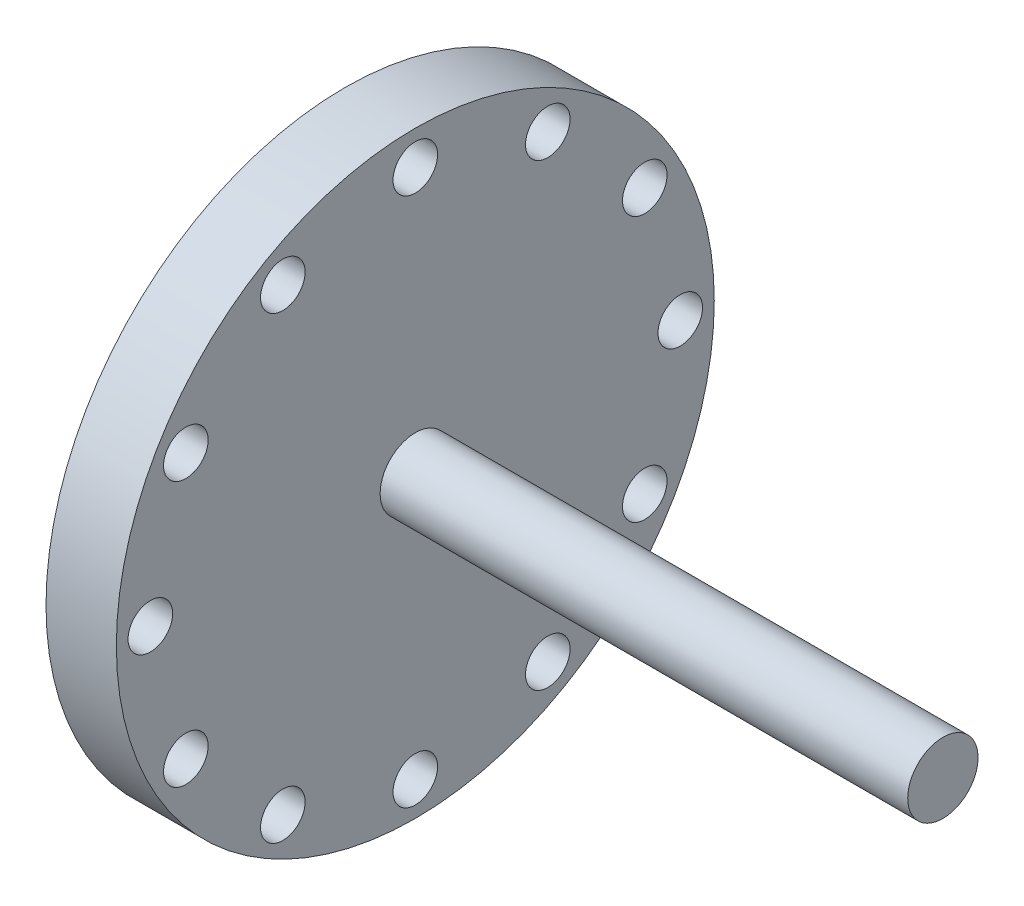
ISO-10303-21;
HEADER;
FILE_DESCRIPTION(('STEP AP214'),'2;1');
FILE_NAME('part.step','',(''),(''),'','','');
FILE_SCHEMA(('AUTOMOTIVE_DESIGN { 1 0 10303 214 1 1 1 1 }'));
ENDSEC;
DATA;
#1=APPLICATION_CONTEXT('core data for automotive mechanical design processes');
#2=APPLICATION_PROTOCOL_DEFINITION('international standard','automotive_design',2000,#1);
#3=PRODUCT_CONTEXT('',#1,'mechanical');
#4=PRODUCT('Part','Part','',(#3));
#5=PRODUCT_RELATED_PRODUCT_CATEGORY('part','',(#4));
#6=PRODUCT_DEFINITION_FORMATION('','',#4);
#7=PRODUCT_DEFINITION_CONTEXT('part definition',#1,'design');
#8=PRODUCT_DEFINITION('design','',#6,#7);
#9=PRODUCT_DEFINITION_SHAPE('','',#8);
#10=(LENGTH_UNIT() NAMED_UNIT(*) SI_UNIT(.MILLI.,.METRE.));
#11=(NAMED_UNIT(*) PLANE_ANGLE_UNIT() SI_UNIT($,.RADIAN.));
#12=(NAMED_UNIT(*) SI_UNIT($,.STERADIAN.) SOLID_ANGLE_UNIT());
#13=UNCERTAINTY_MEASURE_WITH_UNIT(LENGTH_MEASURE(1.E-05),#10,'distance_accuracy_value','');
#14=(GEOMETRIC_REPRESENTATION_CONTEXT(3) GLOBAL_UNCERTAINTY_ASSIGNED_CONTEXT((#13)) GLOBAL_UNIT_ASSIGNED_CONTEXT((#10,
#11,#12)) REPRESENTATION_CONTEXT('',''));
#15=CARTESIAN_POINT('',(0.,0.,0.));
#16=DIRECTION('',(0.,0.,1.));
#17=DIRECTION('',(1.,0.,0.));
#18=AXIS2_PLACEMENT_3D('',#15,#16,#17);
#19=CARTESIAN_POINT('',(0.,0.,0.));
#20=DIRECTION('',(1.,0.,0.));
#21=DIRECTION('',(0.,0.,-1.));
#22=AXIS2_PLACEMENT_3D('',#19,#20,#21);
#23=PLANE('',#22);
#24=CARTESIAN_POINT('',(0.,0.,0.));
#25=DIRECTION('',(-1.,0.,0.));
#26=DIRECTION('',(0.,0.,1.));
#27=AXIS2_PLACEMENT_3D('',#24,#25,#26);
#28=CIRCLE('',#27,20.);
#29=CARTESIAN_POINT('',(0.,0.,20.));
#30=VERTEX_POINT('',#29);
#31=EDGE_CURVE('E10',#30,#30,#28,.T.);
#32=ORIENTED_EDGE('',*,*,#31,.T.);
#33=EDGE_LOOP('',(#32));
#34=FACE_BOUND('',#33,.T.);
#35=ADVANCED_FACE('F37',(#34),#23,.F.);
#36=CARTESIAN_POINT('',(0.,0.,0.));
#37=DIRECTION('',(-1.,0.,0.));
#38=DIRECTION('',(0.,0.,1.));
#39=AXIS2_PLACEMENT_3D('',#36,#37,#38);
#40=CYLINDRICAL_SURFACE('',#39,20.);
#41=ORIENTED_EDGE('',*,*,#31,.F.);
#42=EDGE_LOOP('',(#41));
#43=FACE_BOUND('',#42,.T.);
#44=CARTESIAN_POINT('',(10.,0.,0.));
#45=DIRECTION('',(-1.,0.,0.));
#46=DIRECTION('',(0.,0.,1.));
#47=AXIS2_PLACEMENT_3D('',#44,#45,#46);
#48=CIRCLE('',#47,20.);
#49=CARTESIAN_POINT('',(10.,0.,20.));
#50=VERTEX_POINT('',#49);
#51=EDGE_CURVE('E44',#50,#50,#48,.T.);
#52=ORIENTED_EDGE('',*,*,#51,.T.);
#53=EDGE_LOOP('',(#52));
#54=FACE_BOUND('',#53,.T.);
#55=ADVANCED_FACE('F169',(#43,#54),#40,.T.);
#56=CARTESIAN_POINT('',(10.,20.,0.));
#57=DIRECTION('',(1.,0.,0.));
#58=DIRECTION('',(0.,0.,-1.));
#59=AXIS2_PLACEMENT_3D('',#56,#57,#58);
#60=PLANE('',#59);
#61=CARTESIAN_POINT('',(10.,97.8608706276416,-56.5));
#62=DIRECTION('',(1.,0.,0.));
#63=DIRECTION('',(0.,0.,-1.));
#64=AXIS2_PLACEMENT_3D('',#61,#62,#63);
#65=CIRCLE('',#64,9.50000000000001);
#66=CARTESIAN_POINT('',(10.,97.8608706276416,-66.));
#67=VERTEX_POINT('',#66);
#68=EDGE_CURVE('E95',#67,#67,#65,.F.);
#69=ORIENTED_EDGE('',*,*,#68,.F.);
#70=EDGE_LOOP('',(#69));
#71=FACE_BOUND('',#70,.T.);
#72=CARTESIAN_POINT('',(10.,56.4999999999999,-97.8608706276416));
#73=DIRECTION('',(1.,0.,0.));
#74=DIRECTION('',(0.,0.,-1.));
#75=AXIS2_PLACEMENT_3D('',#72,#73,#74);
#76=CIRCLE('',#75,9.5);
#77=CARTESIAN_POINT('',(10.,56.4999999999999,-107.360870627642));
#78=VERTEX_POINT('',#77);
#79=EDGE_CURVE('E92',#78,#78,#76,.F.);
#80=ORIENTED_EDGE('',*,*,#79,.F.);
#81=EDGE_LOOP('',(#80));
#82=FACE_BOUND('',#81,.T.);
#83=CARTESIAN_POINT('',(10.,0.,-113.));
#84=DIRECTION('',(1.,0.,0.));
#85=DIRECTION('',(0.,0.,-1.));
#86=AXIS2_PLACEMENT_3D('',#83,#84,#85);
#87=CIRCLE('',#86,9.49999999999999);
#88=CARTESIAN_POINT('',(10.,0.,-122.5));
#89=VERTEX_POINT('',#88);
#90=EDGE_CURVE('E89',#89,#89,#87,.F.);
#91=ORIENTED_EDGE('',*,*,#90,.F.);
#92=EDGE_LOOP('',(#91));
#93=FACE_BOUND('',#92,.T.);
#94=CARTESIAN_POINT('',(10.,-56.5,-97.8608706276415));
#95=DIRECTION('',(1.,0.,0.));
#96=DIRECTION('',(0.,0.,-1.));
#97=AXIS2_PLACEMENT_3D('',#94,#95,#96);
#98=CIRCLE('',#97,9.5);
#99=CARTESIAN_POINT('',(10.,-56.5,-107.360870627642));
#100=VERTEX_POINT('',#99);
#101=EDGE_CURVE('E85',#100,#100,#98,.F.);
#102=ORIENTED_EDGE('',*,*,#101,.F.);
#103=EDGE_LOOP('',(#102));
#104=FACE_BOUND('',#103,.T.);
#105=CARTESIAN_POINT('',(10.,-97.8608706276416,-56.5));
#106=DIRECTION('',(1.,0.,0.));
#107=DIRECTION('',(0.,0.,-1.));
#108=AXIS2_PLACEMENT_3D('',#105,#106,#107);
#109=CIRCLE('',#108,9.50000000000001);
#110=CARTESIAN_POINT('',(10.,-97.8608706276416,-66.));
#111=VERTEX_POINT('',#110);
#112=EDGE_CURVE('E81',#111,#111,#109,.F.);
#113=ORIENTED_EDGE('',*,*,#112,.F.);
#114=EDGE_LOOP('',(#113));
#115=FACE_BOUND('',#114,.T.);
#116=CARTESIAN_POINT('',(10.,-113.,0.));
#117=DIRECTION('',(1.,0.,0.));
#118=DIRECTION('',(0.,0.,-1.));
#119=AXIS2_PLACEMENT_3D('',#116,#117,#118);
#120=CIRCLE('',#119,9.49999999999998);
#121=CARTESIAN_POINT('',(10.,-113.,-9.49999999999998));
#122=VERTEX_POINT('',#121);
#123=EDGE_CURVE('E77',#122,#122,#120,.F.);
#124=ORIENTED_EDGE('',*,*,#123,.F.);
#125=EDGE_LOOP('',(#124));
#126=FACE_BOUND('',#125,.T.);
#127=CARTESIAN_POINT('',(10.,-97.8608706276415,56.5));
#128=DIRECTION('',(1.,0.,0.));
#129=DIRECTION('',(0.,0.,-1.));
#130=AXIS2_PLACEMENT_3D('',#127,#128,#129);
#131=CIRCLE('',#130,9.5);
#132=CARTESIAN_POINT('',(10.,-97.8608706276415,47.));
#133=VERTEX_POINT('',#132);
#134=EDGE_CURVE('E73',#133,#133,#131,.F.);
#135=ORIENTED_EDGE('',*,*,#134,.F.);
#136=EDGE_LOOP('',(#135));
#137=FACE_BOUND('',#136,.T.);
#138=CARTESIAN_POINT('',(10.,-56.5,97.8608706276416));
#139=DIRECTION('',(1.,0.,0.));
#140=DIRECTION('',(0.,0.,-1.));
#141=AXIS2_PLACEMENT_3D('',#138,#139,#140);
#142=CIRCLE('',#141,9.5);
#143=CARTESIAN_POINT('',(10.,-56.5,88.3608706276416));
#144=VERTEX_POINT('',#143);
#145=EDGE_CURVE('E69',#144,#144,#142,.F.);
#146=ORIENTED_EDGE('',*,*,#145,.F.);
#147=EDGE_LOOP('',(#146));
#148=FACE_BOUND('',#147,.T.);
#149=CARTESIAN_POINT('',(10.,0.,113.));
#150=DIRECTION('',(1.,0.,0.));
#151=DIRECTION('',(0.,0.,-1.));
#152=AXIS2_PLACEMENT_3D('',#149,#150,#151);
#153=CIRCLE('',#152,9.49999999999999);
#154=CARTESIAN_POINT('',(10.,0.,103.5));
#155=VERTEX_POINT('',#154);
#156=EDGE_CURVE('E65',#155,#155,#153,.F.);
#157=ORIENTED_EDGE('',*,*,#156,.F.);
#158=EDGE_LOOP('',(#157));
#159=FACE_BOUND('',#158,.T.);
#160=CARTESIAN_POINT('',(10.,56.5,97.8608706276416));
#161=DIRECTION('',(1.,0.,0.));
#162=DIRECTION('',(0.,0.,-1.));
#163=AXIS2_PLACEMENT_3D('',#160,#161,#162);
#164=CIRCLE('',#163,9.5);
#165=CARTESIAN_POINT('',(10.,56.5,88.3608706276416));
#166=VERTEX_POINT('',#165);
#167=EDGE_CURVE('E61',#166,#166,#164,.F.);
#168=ORIENTED_EDGE('',*,*,#167,.F.);
#169=EDGE_LOOP('',(#168));
#170=FACE_BOUND('',#169,.T.);
#171=CARTESIAN_POINT('',(10.,97.8608706276416,56.5));
#172=DIRECTION('',(1.,0.,0.));
#173=DIRECTION('',(0.,0.,-1.));
#174=AXIS2_PLACEMENT_3D('',#171,#172,#173);
#175=CIRCLE('',#174,9.5);
#176=CARTESIAN_POINT('',(10.,97.8608706276416,47.));
#177=VERTEX_POINT('',#176);
#178=EDGE_CURVE('E57',#177,#177,#175,.F.);
#179=ORIENTED_EDGE('',*,*,#178,.F.);
#180=EDGE_LOOP('',(#179));
#181=FACE_BOUND('',#180,.T.);
#182=CARTESIAN_POINT('',(10.,113.,0.));
#183=DIRECTION('',(1.,0.,0.));
#184=DIRECTION('',(0.,0.,-1.));
#185=AXIS2_PLACEMENT_3D('',#182,#183,#184);
#186=CIRCLE('',#185,9.50000000000001);
#187=CARTESIAN_POINT('',(10.,113.,-9.50000000000001));
#188=VERTEX_POINT('',#187);
#189=EDGE_CURVE('E56',#188,#188,#186,.F.);
#190=ORIENTED_EDGE('',*,*,#189,.F.);
#191=EDGE_LOOP('',(#190));
#192=FACE_BOUND('',#191,.T.);
#193=ORIENTED_EDGE('',*,*,#51,.F.);
#194=EDGE_LOOP('',(#193));
#195=FACE_BOUND('',#194,.T.);
#196=CARTESIAN_POINT('',(10.,0.,0.));
#197=DIRECTION('',(-1.,0.,0.));
#198=DIRECTION('',(0.,0.,1.));
#199=AXIS2_PLACEMENT_3D('',#196,#197,#198);
#200=CIRCLE('',#199,127.5);
#201=CARTESIAN_POINT('',(10.,0.,127.5));
#202=VERTEX_POINT('',#201);
#203=EDGE_CURVE('E49',#202,#202,#200,.T.);
#204=ORIENTED_EDGE('',*,*,#203,.T.);
#205=EDGE_LOOP('',(#204));
#206=FACE_BOUND('',#205,.T.);
#207=ADVANCED_FACE('F137',(#71,#82,#93,#104,#115,#126,#137,#148,#159,#170,#181,#192,#195,#206),
#60,.F.);
#208=CARTESIAN_POINT('',(0.,0.,0.));
#209=DIRECTION('',(-1.,0.,0.));
#210=DIRECTION('',(0.,0.,1.));
#211=AXIS2_PLACEMENT_3D('',#208,#209,#210);
#212=CYLINDRICAL_SURFACE('',#211,127.5);
#213=ORIENTED_EDGE('',*,*,#203,.F.);
#214=EDGE_LOOP('',(#213));
#215=FACE_BOUND('',#214,.T.);
#216=CARTESIAN_POINT('',(40.,0.,0.));
#217=DIRECTION('',(-1.,0.,0.));
#218=DIRECTION('',(0.,0.,1.));
#219=AXIS2_PLACEMENT_3D('',#216,#217,#218);
#220=CIRCLE('',#219,127.5);
#221=CARTESIAN_POINT('',(40.,0.,127.5));
#222=VERTEX_POINT('',#221);
#223=EDGE_CURVE('E132',#222,#222,#220,.T.);
#224=ORIENTED_EDGE('',*,*,#223,.T.);
#225=EDGE_LOOP('',(#224));
#226=FACE_BOUND('',#225,.T.);
#227=ADVANCED_FACE('F139',(#215,#226),#212,.T.);
#228=CARTESIAN_POINT('',(40.,127.5,0.));
#229=DIRECTION('',(-1.,0.,0.));
#230=DIRECTION('',(0.,0.,1.));
#231=AXIS2_PLACEMENT_3D('',#228,#229,#230);
#232=PLANE('',#231);
#233=CARTESIAN_POINT('',(40.,97.8608706276416,-56.5));
#234=DIRECTION('',(-1.,0.,0.));
#235=DIRECTION('',(0.,0.,1.));
#236=AXIS2_PLACEMENT_3D('',#233,#234,#235);
#237=CIRCLE('',#236,9.50000000000001);
#238=CARTESIAN_POINT('',(40.,97.8608706276416,-47.));
#239=VERTEX_POINT('',#238);
#240=EDGE_CURVE('E40',#239,#239,#237,.F.);
#241=ORIENTED_EDGE('',*,*,#240,.F.);
#242=EDGE_LOOP('',(#241));
#243=FACE_BOUND('',#242,.T.);
#244=CARTESIAN_POINT('',(40.,56.4999999999999,-97.8608706276416));
#245=DIRECTION('',(-1.,0.,0.));
#246=DIRECTION('',(0.,0.,1.));
#247=AXIS2_PLACEMENT_3D('',#244,#245,#246);
#248=CIRCLE('',#247,9.5);
#249=CARTESIAN_POINT('',(40.,56.4999999999999,-88.3608706276416));
#250=VERTEX_POINT('',#249);
#251=EDGE_CURVE('E93',#250,#250,#248,.F.);
#252=ORIENTED_EDGE('',*,*,#251,.F.);
#253=EDGE_LOOP('',(#252));
#254=FACE_BOUND('',#253,.T.);
#255=CARTESIAN_POINT('',(40.,0.,-113.));
#256=DIRECTION('',(-1.,0.,0.));
#257=DIRECTION('',(0.,0.,1.));
#258=AXIS2_PLACEMENT_3D('',#255,#256,#257);
#259=CIRCLE('',#258,9.49999999999999);
#260=CARTESIAN_POINT('',(40.,0.,-103.5));
#261=VERTEX_POINT('',#260);
#262=EDGE_CURVE('E90',#261,#261,#259,.F.);
#263=ORIENTED_EDGE('',*,*,#262,.F.);
#264=EDGE_LOOP('',(#263));
#265=FACE_BOUND('',#264,.T.);
#266=CARTESIAN_POINT('',(40.,-56.5,-97.8608706276415));
#267=DIRECTION('',(-1.,0.,0.));
#268=DIRECTION('',(0.,0.,1.));
#269=AXIS2_PLACEMENT_3D('',#266,#267,#268);
#270=CIRCLE('',#269,9.5);
#271=CARTESIAN_POINT('',(40.,-56.5,-88.3608706276415));
#272=VERTEX_POINT('',#271);
#273=EDGE_CURVE('E86',#272,#272,#270,.F.);
#274=ORIENTED_EDGE('',*,*,#273,.F.);
#275=EDGE_LOOP('',(#274));
#276=FACE_BOUND('',#275,.T.);
#277=CARTESIAN_POINT('',(40.,-97.8608706276416,-56.5));
#278=DIRECTION('',(-1.,0.,0.));
#279=DIRECTION('',(0.,0.,1.));
#280=AXIS2_PLACEMENT_3D('',#277,#278,#279);
#281=CIRCLE('',#280,9.50000000000001);
#282=CARTESIAN_POINT('',(40.,-97.8608706276416,-47.));
#283=VERTEX_POINT('',#282);
#284=EDGE_CURVE('E82',#283,#283,#281,.F.);
#285=ORIENTED_EDGE('',*,*,#284,.F.);
#286=EDGE_LOOP('',(#285));
#287=FACE_BOUND('',#286,.T.);
#288=CARTESIAN_POINT('',(40.,-113.,0.));
#289=DIRECTION('',(-1.,0.,0.));
#290=DIRECTION('',(0.,0.,1.));
#291=AXIS2_PLACEMENT_3D('',#288,#289,#290);
#292=CIRCLE('',#291,9.49999999999998);
#293=CARTESIAN_POINT('',(40.,-113.,9.49999999999998));
#294=VERTEX_POINT('',#293);
#295=EDGE_CURVE('E78',#294,#294,#292,.F.);
#296=ORIENTED_EDGE('',*,*,#295,.F.);
#297=EDGE_LOOP('',(#296));
#298=FACE_BOUND('',#297,.T.);
#299=CARTESIAN_POINT('',(40.,-97.8608706276415,56.5));
#300=DIRECTION('',(-1.,0.,0.));
#301=DIRECTION('',(0.,0.,1.));
#302=AXIS2_PLACEMENT_3D('',#299,#300,#301);
#303=CIRCLE('',#302,9.5);
#304=CARTESIAN_POINT('',(40.,-97.8608706276415,66.));
#305=VERTEX_POINT('',#304);
#306=EDGE_CURVE('E74',#305,#305,#303,.F.);
#307=ORIENTED_EDGE('',*,*,#306,.F.);
#308=EDGE_LOOP('',(#307));
#309=FACE_BOUND('',#308,.T.);
#310=CARTESIAN_POINT('',(40.,-56.5,97.8608706276416));
#311=DIRECTION('',(-1.,0.,0.));
#312=DIRECTION('',(0.,0.,1.));
#313=AXIS2_PLACEMENT_3D('',#310,#311,#312);
#314=CIRCLE('',#313,9.5);
#315=CARTESIAN_POINT('',(40.,-56.5,107.360870627642));
#316=VERTEX_POINT('',#315);
#317=EDGE_CURVE('E70',#316,#316,#314,.F.);
#318=ORIENTED_EDGE('',*,*,#317,.F.);
#319=EDGE_LOOP('',(#318));
#320=FACE_BOUND('',#319,.T.);
#321=CARTESIAN_POINT('',(40.,0.,113.));
#322=DIRECTION('',(-1.,0.,0.));
#323=DIRECTION('',(0.,0.,1.));
#324=AXIS2_PLACEMENT_3D('',#321,#322,#323);
#325=CIRCLE('',#324,9.49999999999999);
#326=CARTESIAN_POINT('',(40.,0.,122.5));
#327=VERTEX_POINT('',#326);
#328=EDGE_CURVE('E66',#327,#327,#325,.F.);
#329=ORIENTED_EDGE('',*,*,#328,.F.);
#330=EDGE_LOOP('',(#329));
#331=FACE_BOUND('',#330,.T.);
#332=CARTESIAN_POINT('',(40.,56.5,97.8608706276416));
#333=DIRECTION('',(-1.,0.,0.));
#334=DIRECTION('',(0.,0.,1.));
#335=AXIS2_PLACEMENT_3D('',#332,#333,#334);
#336=CIRCLE('',#335,9.5);
#337=CARTESIAN_POINT('',(40.,56.5,107.360870627642));
#338=VERTEX_POINT('',#337);
#339=EDGE_CURVE('E62',#338,#338,#336,.F.);
#340=ORIENTED_EDGE('',*,*,#339,.F.);
#341=EDGE_LOOP('',(#340));
#342=FACE_BOUND('',#341,.T.);
#343=CARTESIAN_POINT('',(40.,97.8608706276416,56.5));
#344=DIRECTION('',(-1.,0.,0.));
#345=DIRECTION('',(0.,0.,1.));
#346=AXIS2_PLACEMENT_3D('',#343,#344,#345);
#347=CIRCLE('',#346,9.5);
#348=CARTESIAN_POINT('',(40.,97.8608706276416,66.));
#349=VERTEX_POINT('',#348);
#350=EDGE_CURVE('E58',#349,#349,#347,.F.);
#351=ORIENTED_EDGE('',*,*,#350,.F.);
#352=EDGE_LOOP('',(#351));
#353=FACE_BOUND('',#352,.T.);
#354=CARTESIAN_POINT('',(40.,113.,0.));
#355=DIRECTION('',(-1.,0.,0.));
#356=DIRECTION('',(0.,0.,1.));
#357=AXIS2_PLACEMENT_3D('',#354,#355,#356);
#358=CIRCLE('',#357,9.50000000000001);
#359=CARTESIAN_POINT('',(40.,113.,9.50000000000001));
#360=VERTEX_POINT('',#359);
#361=EDGE_CURVE('E53',#360,#360,#358,.F.);
#362=ORIENTED_EDGE('',*,*,#361,.F.);
#363=EDGE_LOOP('',(#362));
#364=FACE_BOUND('',#363,.T.);
#365=ORIENTED_EDGE('',*,*,#223,.F.);
#366=EDGE_LOOP('',(#365));
#367=FACE_BOUND('',#366,.T.);
#368=CARTESIAN_POINT('',(40.,0.,0.));
#369=DIRECTION('',(-1.,0.,0.));
#370=DIRECTION('',(0.,0.,1.));
#371=AXIS2_PLACEMENT_3D('',#368,#369,#370);
#372=CIRCLE('',#371,15.);
#373=CARTESIAN_POINT('',(40.,0.,15.));
#374=VERTEX_POINT('',#373);
#375=EDGE_CURVE('E129',#374,#374,#372,.T.);
#376=ORIENTED_EDGE('',*,*,#375,.T.);
#377=EDGE_LOOP('',(#376));
#378=FACE_BOUND('',#377,.T.);
#379=ADVANCED_FACE('F142',(#243,#254,#265,#276,#287,#298,#309,#320,#331,#342,#353,#364,#367,
#378),#232,.F.);
#380=CARTESIAN_POINT('',(0.,0.,0.));
#381=DIRECTION('',(-1.,0.,0.));
#382=DIRECTION('',(0.,0.,1.));
#383=AXIS2_PLACEMENT_3D('',#380,#381,#382);
#384=CYLINDRICAL_SURFACE('',#383,15.);
#385=ORIENTED_EDGE('',*,*,#375,.F.);
#386=EDGE_LOOP('',(#385));
#387=FACE_BOUND('',#386,.T.);
#388=CARTESIAN_POINT('',(265.,0.,0.));
#389=DIRECTION('',(-1.,0.,0.));
#390=DIRECTION('',(0.,0.,1.));
#391=AXIS2_PLACEMENT_3D('',#388,#389,#390);
#392=CIRCLE('',#391,15.);
#393=CARTESIAN_POINT('',(265.,0.,15.));
#394=VERTEX_POINT('',#393);
#395=EDGE_CURVE('E126',#394,#394,#392,.T.);
#396=ORIENTED_EDGE('',*,*,#395,.T.);
#397=EDGE_LOOP('',(#396));
#398=FACE_BOUND('',#397,.T.);
#399=ADVANCED_FACE('F148',(#387,#398),#384,.T.);
#400=CARTESIAN_POINT('',(265.,0.,0.));
#401=DIRECTION('',(-1.,0.,0.));
#402=DIRECTION('',(0.,0.,1.));
#403=AXIS2_PLACEMENT_3D('',#400,#401,#402);
#404=PLANE('',#403);
#405=ORIENTED_EDGE('',*,*,#395,.F.);
#406=EDGE_LOOP('',(#405));
#407=FACE_BOUND('',#406,.T.);
#408=ADVANCED_FACE('F155',(#407),#404,.F.);
#409=CARTESIAN_POINT('',(265.,113.,0.));
#410=DIRECTION('',(-1.,0.,0.));
#411=DIRECTION('',(0.,0.,1.));
#412=AXIS2_PLACEMENT_3D('',#409,#410,#411);
#413=CYLINDRICAL_SURFACE('',#412,9.50000000000001);
#414=ORIENTED_EDGE('',*,*,#361,.T.);
#415=EDGE_LOOP('',(#414));
#416=FACE_BOUND('',#415,.T.);
#417=ORIENTED_EDGE('',*,*,#189,.T.);
#418=EDGE_LOOP('',(#417));
#419=FACE_BOUND('',#418,.T.);
#420=ADVANCED_FACE('F160',(#416,#419),#413,.F.);
#421=CARTESIAN_POINT('',(265.,97.8608706276416,56.5));
#422=DIRECTION('',(-1.,0.,0.));
#423=DIRECTION('',(0.,0.,1.));
#424=AXIS2_PLACEMENT_3D('',#421,#422,#423);
#425=CYLINDRICAL_SURFACE('',#424,9.5);
#426=ORIENTED_EDGE('',*,*,#350,.T.);
#427=EDGE_LOOP('',(#426));
#428=FACE_BOUND('',#427,.T.);
#429=ORIENTED_EDGE('',*,*,#178,.T.);
#430=EDGE_LOOP('',(#429));
#431=FACE_BOUND('',#430,.T.);
#432=ADVANCED_FACE('F165',(#428,#431),#425,.F.);
#433=CARTESIAN_POINT('',(265.,56.5,97.8608706276416));
#434=DIRECTION('',(-1.,0.,0.));
#435=DIRECTION('',(0.,0.,1.));
#436=AXIS2_PLACEMENT_3D('',#433,#434,#435);
#437=CYLINDRICAL_SURFACE('',#436,9.5);
#438=ORIENTED_EDGE('',*,*,#339,.T.);
#439=EDGE_LOOP('',(#438));
#440=FACE_BOUND('',#439,.T.);
#441=ORIENTED_EDGE('',*,*,#167,.T.);
#442=EDGE_LOOP('',(#441));
#443=FACE_BOUND('',#442,.T.);
#444=ADVANCED_FACE('F210',(#440,#443),#437,.F.);
#445=CARTESIAN_POINT('',(265.,0.,113.));
#446=DIRECTION('',(-1.,0.,0.));
#447=DIRECTION('',(0.,0.,1.));
#448=AXIS2_PLACEMENT_3D('',#445,#446,#447);
#449=CYLINDRICAL_SURFACE('',#448,9.49999999999999);
#450=ORIENTED_EDGE('',*,*,#328,.T.);
#451=EDGE_LOOP('',(#450));
#452=FACE_BOUND('',#451,.T.);
#453=ORIENTED_EDGE('',*,*,#156,.T.);
#454=EDGE_LOOP('',(#453));
#455=FACE_BOUND('',#454,.T.);
#456=ADVANCED_FACE('F216',(#452,#455),#449,.F.);
#457=CARTESIAN_POINT('',(265.,-56.5,97.8608706276416));
#458=DIRECTION('',(-1.,0.,0.));
#459=DIRECTION('',(0.,0.,1.));
#460=AXIS2_PLACEMENT_3D('',#457,#458,#459);
#461=CYLINDRICAL_SURFACE('',#460,9.5);
#462=ORIENTED_EDGE('',*,*,#317,.T.);
#463=EDGE_LOOP('',(#462));
#464=FACE_BOUND('',#463,.T.);
#465=ORIENTED_EDGE('',*,*,#145,.T.);
#466=EDGE_LOOP('',(#465));
#467=FACE_BOUND('',#466,.T.);
#468=ADVANCED_FACE('F222',(#464,#467),#461,.F.);
#469=CARTESIAN_POINT('',(265.,-97.8608706276415,56.5));
#470=DIRECTION('',(-1.,0.,0.));
#471=DIRECTION('',(0.,0.,1.));
#472=AXIS2_PLACEMENT_3D('',#469,#470,#471);
#473=CYLINDRICAL_SURFACE('',#472,9.5);
#474=ORIENTED_EDGE('',*,*,#306,.T.);
#475=EDGE_LOOP('',(#474));
#476=FACE_BOUND('',#475,.T.);
#477=ORIENTED_EDGE('',*,*,#134,.T.);
#478=EDGE_LOOP('',(#477));
#479=FACE_BOUND('',#478,.T.);
#480=ADVANCED_FACE('F226',(#476,#479),#473,.F.);
#481=CARTESIAN_POINT('',(265.,-113.,0.));
#482=DIRECTION('',(-1.,0.,0.));
#483=DIRECTION('',(0.,0.,1.));
#484=AXIS2_PLACEMENT_3D('',#481,#482,#483);
#485=CYLINDRICAL_SURFACE('',#484,9.49999999999998);
#486=ORIENTED_EDGE('',*,*,#295,.T.);
#487=EDGE_LOOP('',(#486));
#488=FACE_BOUND('',#487,.T.);
#489=ORIENTED_EDGE('',*,*,#123,.T.);
#490=EDGE_LOOP('',(#489));
#491=FACE_BOUND('',#490,.T.);
#492=ADVANCED_FACE('F230',(#488,#491),#485,.F.);
#493=CARTESIAN_POINT('',(265.,-97.8608706276416,-56.5));
#494=DIRECTION('',(-1.,0.,0.));
#495=DIRECTION('',(0.,0.,1.));
#496=AXIS2_PLACEMENT_3D('',#493,#494,#495);
#497=CYLINDRICAL_SURFACE('',#496,9.50000000000001);
#498=ORIENTED_EDGE('',*,*,#284,.T.);
#499=EDGE_LOOP('',(#498));
#500=FACE_BOUND('',#499,.T.);
#501=ORIENTED_EDGE('',*,*,#112,.T.);
#502=EDGE_LOOP('',(#501));
#503=FACE_BOUND('',#502,.T.);
#504=ADVANCED_FACE('F234',(#500,#503),#497,.F.);
#505=CARTESIAN_POINT('',(265.,-56.5,-97.8608706276415));
#506=DIRECTION('',(-1.,0.,0.));
#507=DIRECTION('',(0.,0.,1.));
#508=AXIS2_PLACEMENT_3D('',#505,#506,#507);
#509=CYLINDRICAL_SURFACE('',#508,9.5);
#510=ORIENTED_EDGE('',*,*,#273,.T.);
#511=EDGE_LOOP('',(#510));
#512=FACE_BOUND('',#511,.T.);
#513=ORIENTED_EDGE('',*,*,#101,.T.);
#514=EDGE_LOOP('',(#513));
#515=FACE_BOUND('',#514,.T.);
#516=ADVANCED_FACE('F238',(#512,#515),#509,.F.);
#517=CARTESIAN_POINT('',(265.,0.,-113.));
#518=DIRECTION('',(-1.,0.,0.));
#519=DIRECTION('',(0.,0.,1.));
#520=AXIS2_PLACEMENT_3D('',#517,#518,#519);
#521=CYLINDRICAL_SURFACE('',#520,9.49999999999999);
#522=ORIENTED_EDGE('',*,*,#262,.T.);
#523=EDGE_LOOP('',(#522));
#524=FACE_BOUND('',#523,.T.);
#525=ORIENTED_EDGE('',*,*,#90,.T.);
#526=EDGE_LOOP('',(#525));
#527=FACE_BOUND('',#526,.T.);
#528=ADVANCED_FACE('F242',(#524,#527),#521,.F.);
#529=CARTESIAN_POINT('',(265.,56.4999999999999,-97.8608706276416));
#530=DIRECTION('',(-1.,0.,0.));
#531=DIRECTION('',(0.,0.,1.));
#532=AXIS2_PLACEMENT_3D('',#529,#530,#531);
#533=CYLINDRICAL_SURFACE('',#532,9.5);
#534=ORIENTED_EDGE('',*,*,#251,.T.);
#535=EDGE_LOOP('',(#534));
#536=FACE_BOUND('',#535,.T.);
#537=ORIENTED_EDGE('',*,*,#79,.T.);
#538=EDGE_LOOP('',(#537));
#539=FACE_BOUND('',#538,.T.);
#540=ADVANCED_FACE('F246',(#536,#539),#533,.F.);
#541=CARTESIAN_POINT('',(265.,97.8608706276416,-56.5));
#542=DIRECTION('',(-1.,0.,0.));
#543=DIRECTION('',(0.,0.,1.));
#544=AXIS2_PLACEMENT_3D('',#541,#542,#543);
#545=CYLINDRICAL_SURFACE('',#544,9.50000000000001);
#546=ORIENTED_EDGE('',*,*,#240,.T.);
#547=EDGE_LOOP('',(#546));
#548=FACE_BOUND('',#547,.T.);
#549=ORIENTED_EDGE('',*,*,#68,.T.);
#550=EDGE_LOOP('',(#549));
#551=FACE_BOUND('',#550,.T.);
#552=ADVANCED_FACE('F249',(#548,#551),#545,.F.);
#553=CLOSED_SHELL('',(#35,#55,#207,#227,#379,#399,#408,#420,#432,#444,#456,#468,#480,#492,#504,
#516,#528,#540,#552));
#554=MANIFOLD_SOLID_BREP('B2',#553);
#555=ADVANCED_BREP_SHAPE_REPRESENTATION('',(#18,#554),#14);
#556=SHAPE_DEFINITION_REPRESENTATION(#9,#555);
ENDSEC;
END-ISO-10303-21;
